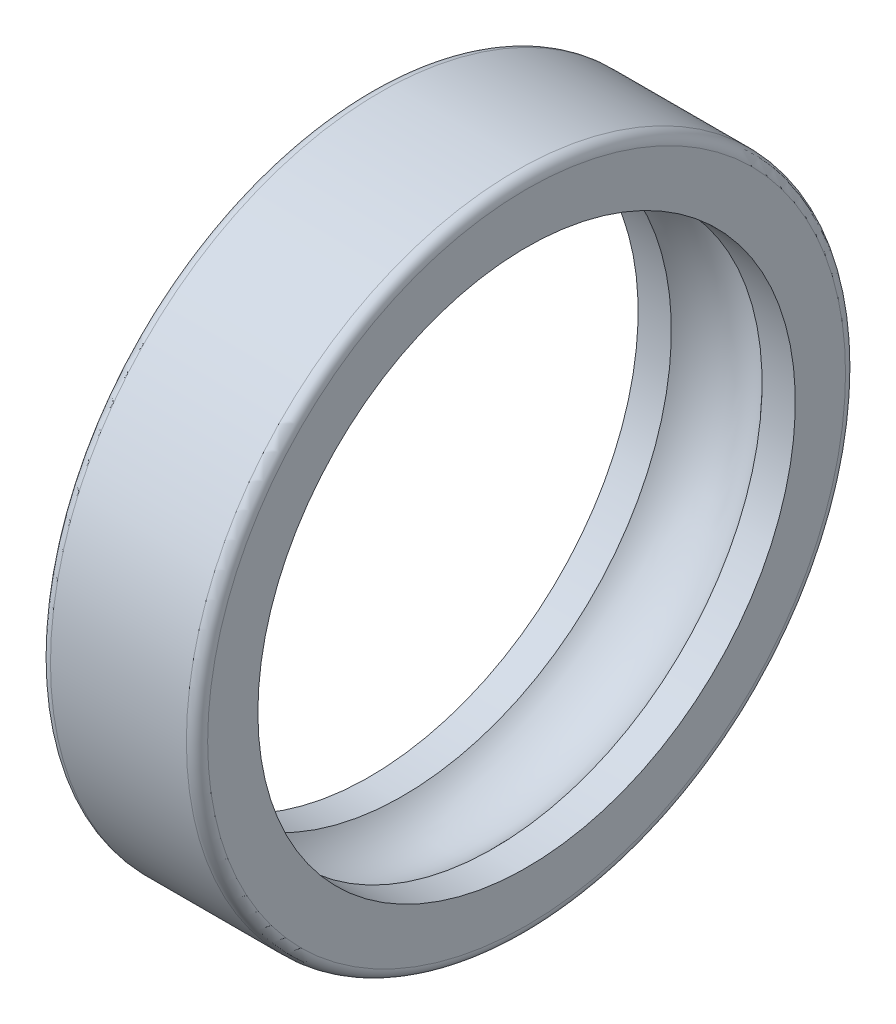
ISO-10303-21;
HEADER;
FILE_DESCRIPTION(('STEP AP214'),'2;1');
FILE_NAME('part.step','',(''),(''),'','','');
FILE_SCHEMA(('AUTOMOTIVE_DESIGN { 1 0 10303 214 1 1 1 1 }'));
ENDSEC;
DATA;
#1=APPLICATION_CONTEXT('core data for automotive mechanical design processes');
#2=APPLICATION_PROTOCOL_DEFINITION('international standard','automotive_design',2000,#1);
#3=PRODUCT_CONTEXT('',#1,'mechanical');
#4=PRODUCT('Part','Part','',(#3));
#5=PRODUCT_RELATED_PRODUCT_CATEGORY('part','',(#4));
#6=PRODUCT_DEFINITION_FORMATION('','',#4);
#7=PRODUCT_DEFINITION_CONTEXT('part definition',#1,'design');
#8=PRODUCT_DEFINITION('design','',#6,#7);
#9=PRODUCT_DEFINITION_SHAPE('','',#8);
#10=(LENGTH_UNIT() NAMED_UNIT(*) SI_UNIT(.MILLI.,.METRE.));
#11=(NAMED_UNIT(*) PLANE_ANGLE_UNIT() SI_UNIT($,.RADIAN.));
#12=(NAMED_UNIT(*) SI_UNIT($,.STERADIAN.) SOLID_ANGLE_UNIT());
#13=UNCERTAINTY_MEASURE_WITH_UNIT(LENGTH_MEASURE(1.E-05),#10,'distance_accuracy_value','');
#14=(GEOMETRIC_REPRESENTATION_CONTEXT(3) GLOBAL_UNCERTAINTY_ASSIGNED_CONTEXT((#13)) GLOBAL_UNIT_ASSIGNED_CONTEXT((#10,
#11,#12)) REPRESENTATION_CONTEXT('',''));
#15=CARTESIAN_POINT('',(0.,0.,0.));
#16=DIRECTION('',(0.,0.,1.));
#17=DIRECTION('',(1.,0.,0.));
#18=AXIS2_PLACEMENT_3D('',#15,#16,#17);
#19=CARTESIAN_POINT('',(-15.5,0.,-65.));
#20=DIRECTION('',(1.,0.,0.));
#21=DIRECTION('',(0.,0.,-1.));
#22=AXIS2_PLACEMENT_3D('',#19,#20,#21);
#23=PLANE('',#22);
#24=CARTESIAN_POINT('',(-15.5,0.,0.));
#25=DIRECTION('',(1.,0.,0.));
#26=DIRECTION('',(0.,0.,-1.));
#27=AXIS2_PLACEMENT_3D('',#24,#25,#26);
#28=CIRCLE('',#27,62.9);
#29=CARTESIAN_POINT('',(-15.5,0.,-62.9));
#30=VERTEX_POINT('',#29);
#31=EDGE_CURVE('E10',#30,#30,#28,.F.);
#32=ORIENTED_EDGE('',*,*,#31,.T.);
#33=EDGE_LOOP('',(#32));
#34=FACE_BOUND('',#33,.T.);
#35=CARTESIAN_POINT('',(-15.5,0.,0.));
#36=DIRECTION('',(-1.,0.,0.));
#37=DIRECTION('',(0.,0.,1.));
#38=AXIS2_PLACEMENT_3D('',#35,#36,#37);
#39=CIRCLE('',#38,53.);
#40=CARTESIAN_POINT('',(-15.5,0.,53.));
#41=VERTEX_POINT('',#40);
#42=EDGE_CURVE('E73',#41,#41,#39,.T.);
#43=ORIENTED_EDGE('',*,*,#42,.F.);
#44=EDGE_LOOP('',(#43));
#45=FACE_BOUND('',#44,.T.);
#46=ADVANCED_FACE('F37',(#34,#45),#23,.F.);
#47=CARTESIAN_POINT('',(-67.7310924369748,0.,0.));
#48=DIRECTION('',(-1.,0.,0.));
#49=DIRECTION('',(0.,0.,1.));
#50=AXIS2_PLACEMENT_3D('',#47,#48,#49);
#51=CYLINDRICAL_SURFACE('',#50,65.);
#52=CARTESIAN_POINT('',(13.4,0.,0.));
#53=DIRECTION('',(1.,0.,0.));
#54=DIRECTION('',(0.,0.,-1.));
#55=AXIS2_PLACEMENT_3D('',#52,#53,#54);
#56=CIRCLE('',#55,65.);
#57=CARTESIAN_POINT('',(13.4,0.,-65.));
#58=VERTEX_POINT('',#57);
#59=EDGE_CURVE('E50',#58,#58,#56,.F.);
#60=ORIENTED_EDGE('',*,*,#59,.T.);
#61=EDGE_LOOP('',(#60));
#62=FACE_BOUND('',#61,.T.);
#63=CARTESIAN_POINT('',(-13.4,0.,0.));
#64=DIRECTION('',(1.,0.,0.));
#65=DIRECTION('',(0.,0.,-1.));
#66=AXIS2_PLACEMENT_3D('',#63,#64,#65);
#67=CIRCLE('',#66,65.);
#68=CARTESIAN_POINT('',(-13.4,0.,-65.));
#69=VERTEX_POINT('',#68);
#70=EDGE_CURVE('E55',#69,#69,#67,.T.);
#71=ORIENTED_EDGE('',*,*,#70,.T.);
#72=EDGE_LOOP('',(#71));
#73=FACE_BOUND('',#72,.T.);
#74=ADVANCED_FACE('F81',(#62,#73),#51,.T.);
#75=CARTESIAN_POINT('',(15.5,0.,-65.));
#76=DIRECTION('',(1.,0.,0.));
#77=DIRECTION('',(0.,0.,-1.));
#78=AXIS2_PLACEMENT_3D('',#75,#76,#77);
#79=PLANE('',#78);
#80=CARTESIAN_POINT('',(15.5,0.,0.));
#81=DIRECTION('',(1.,0.,0.));
#82=DIRECTION('',(0.,0.,-1.));
#83=AXIS2_PLACEMENT_3D('',#80,#81,#82);
#84=CIRCLE('',#83,62.9);
#85=CARTESIAN_POINT('',(15.5,0.,-62.9));
#86=VERTEX_POINT('',#85);
#87=EDGE_CURVE('E45',#86,#86,#84,.T.);
#88=ORIENTED_EDGE('',*,*,#87,.T.);
#89=EDGE_LOOP('',(#88));
#90=FACE_BOUND('',#89,.T.);
#91=CARTESIAN_POINT('',(15.5,0.,0.));
#92=DIRECTION('',(-1.,0.,0.));
#93=DIRECTION('',(0.,0.,1.));
#94=AXIS2_PLACEMENT_3D('',#91,#92,#93);
#95=CIRCLE('',#94,53.);
#96=CARTESIAN_POINT('',(15.5,0.,53.));
#97=VERTEX_POINT('',#96);
#98=EDGE_CURVE('E61',#97,#97,#95,.T.);
#99=ORIENTED_EDGE('',*,*,#98,.T.);
#100=EDGE_LOOP('',(#99));
#101=FACE_BOUND('',#100,.T.);
#102=ADVANCED_FACE('F86',(#90,#101),#79,.T.);
#103=CARTESIAN_POINT('',(-67.7310924369748,0.,0.));
#104=DIRECTION('',(-1.,0.,0.));
#105=DIRECTION('',(0.,0.,1.));
#106=AXIS2_PLACEMENT_3D('',#103,#104,#105);
#107=CYLINDRICAL_SURFACE('',#106,53.);
#108=CARTESIAN_POINT('',(8.94427190999916,0.,0.));
#109=DIRECTION('',(-1.,0.,0.));
#110=DIRECTION('',(0.,0.,1.));
#111=AXIS2_PLACEMENT_3D('',#108,#109,#110);
#112=CIRCLE('',#111,53.);
#113=CARTESIAN_POINT('',(8.94427190999916,0.,53.));
#114=VERTEX_POINT('',#113);
#115=EDGE_CURVE('E65',#114,#114,#112,.T.);
#116=ORIENTED_EDGE('',*,*,#115,.T.);
#117=EDGE_LOOP('',(#116));
#118=FACE_BOUND('',#117,.T.);
#119=ORIENTED_EDGE('',*,*,#98,.F.);
#120=EDGE_LOOP('',(#119));
#121=FACE_BOUND('',#120,.T.);
#122=ADVANCED_FACE('F109',(#118,#121),#107,.F.);
#123=CARTESIAN_POINT('',(0.,0.,0.));
#124=DIRECTION('',(-1.,0.,0.));
#125=DIRECTION('',(0.,0.,1.));
#126=AXIS2_PLACEMENT_3D('',#123,#124,#125);
#127=TOROIDAL_SURFACE('',#126,45.,12.);
#128=ORIENTED_EDGE('',*,*,#115,.F.);
#129=EDGE_LOOP('',(#128));
#130=FACE_BOUND('',#129,.T.);
#131=CARTESIAN_POINT('',(-8.94427190999916,0.,0.));
#132=DIRECTION('',(-1.,0.,0.));
#133=DIRECTION('',(0.,0.,1.));
#134=AXIS2_PLACEMENT_3D('',#131,#132,#133);
#135=CIRCLE('',#134,53.);
#136=CARTESIAN_POINT('',(-8.94427190999916,0.,53.));
#137=VERTEX_POINT('',#136);
#138=EDGE_CURVE('E69',#137,#137,#135,.T.);
#139=ORIENTED_EDGE('',*,*,#138,.T.);
#140=EDGE_LOOP('',(#139));
#141=FACE_BOUND('',#140,.T.);
#142=ADVANCED_FACE('F98',(#130,#141),#127,.F.);
#143=CARTESIAN_POINT('',(-67.7310924369748,0.,0.));
#144=DIRECTION('',(-1.,0.,0.));
#145=DIRECTION('',(0.,0.,1.));
#146=AXIS2_PLACEMENT_3D('',#143,#144,#145);
#147=CYLINDRICAL_SURFACE('',#146,53.);
#148=ORIENTED_EDGE('',*,*,#138,.F.);
#149=EDGE_LOOP('',(#148));
#150=FACE_BOUND('',#149,.T.);
#151=ORIENTED_EDGE('',*,*,#42,.T.);
#152=EDGE_LOOP('',(#151));
#153=FACE_BOUND('',#152,.T.);
#154=ADVANCED_FACE('F78',(#150,#153),#147,.F.);
#155=CARTESIAN_POINT('',(13.4,0.,0.));
#156=DIRECTION('',(1.,0.,0.));
#157=DIRECTION('',(0.,0.,-1.));
#158=AXIS2_PLACEMENT_3D('',#155,#156,#157);
#159=TOROIDAL_SURFACE('',#158,62.9,2.1);
#160=ORIENTED_EDGE('',*,*,#87,.F.);
#161=EDGE_LOOP('',(#160));
#162=FACE_BOUND('',#161,.T.);
#163=ORIENTED_EDGE('',*,*,#59,.F.);
#164=EDGE_LOOP('',(#163));
#165=FACE_BOUND('',#164,.T.);
#166=ADVANCED_FACE('F90',(#162,#165),#159,.T.);
#167=CARTESIAN_POINT('',(-13.4,0.,0.));
#168=DIRECTION('',(1.,0.,0.));
#169=DIRECTION('',(0.,0.,-1.));
#170=AXIS2_PLACEMENT_3D('',#167,#168,#169);
#171=TOROIDAL_SURFACE('',#170,62.9,2.1);
#172=ORIENTED_EDGE('',*,*,#70,.F.);
#173=EDGE_LOOP('',(#172));
#174=FACE_BOUND('',#173,.T.);
#175=ORIENTED_EDGE('',*,*,#31,.F.);
#176=EDGE_LOOP('',(#175));
#177=FACE_BOUND('',#176,.T.);
#178=ADVANCED_FACE('F39',(#174,#177),#171,.T.);
#179=CLOSED_SHELL('',(#46,#74,#102,#122,#142,#154,#166,#178));
#180=MANIFOLD_SOLID_BREP('B2',#179);
#181=ADVANCED_BREP_SHAPE_REPRESENTATION('',(#18,#180),#14);
#182=SHAPE_DEFINITION_REPRESENTATION(#9,#181);
ENDSEC;
END-ISO-10303-21;
